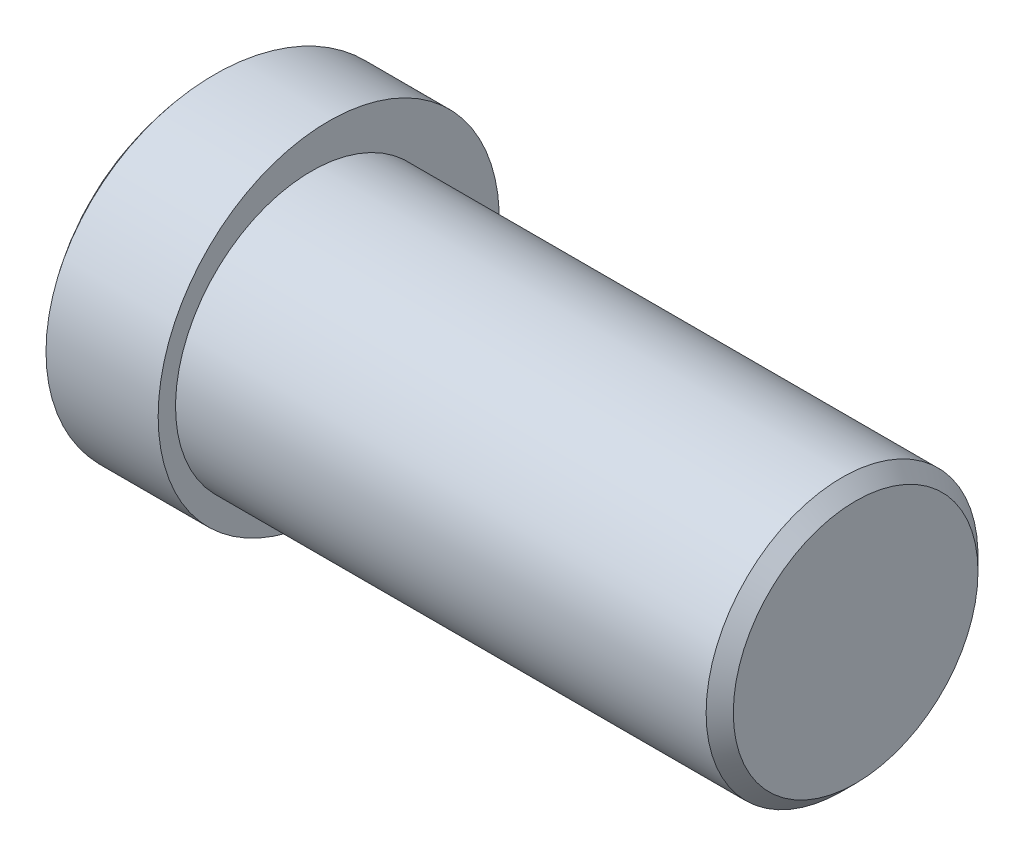
ISO-10303-21;
HEADER;
FILE_DESCRIPTION(('STEP AP214'),'2;1');
FILE_NAME('part.step','',(''),(''),'','','');
FILE_SCHEMA(('AUTOMOTIVE_DESIGN { 1 0 10303 214 1 1 1 1 }'));
ENDSEC;
DATA;
#1=APPLICATION_CONTEXT('core data for automotive mechanical design processes');
#2=APPLICATION_PROTOCOL_DEFINITION('international standard','automotive_design',2000,#1);
#3=PRODUCT_CONTEXT('',#1,'mechanical');
#4=PRODUCT('Part','Part','',(#3));
#5=PRODUCT_RELATED_PRODUCT_CATEGORY('part','',(#4));
#6=PRODUCT_DEFINITION_FORMATION('','',#4);
#7=PRODUCT_DEFINITION_CONTEXT('part definition',#1,'design');
#8=PRODUCT_DEFINITION('design','',#6,#7);
#9=PRODUCT_DEFINITION_SHAPE('','',#8);
#10=(LENGTH_UNIT() NAMED_UNIT(*) SI_UNIT(.MILLI.,.METRE.));
#11=(NAMED_UNIT(*) PLANE_ANGLE_UNIT() SI_UNIT($,.RADIAN.));
#12=(NAMED_UNIT(*) SI_UNIT($,.STERADIAN.) SOLID_ANGLE_UNIT());
#13=UNCERTAINTY_MEASURE_WITH_UNIT(LENGTH_MEASURE(1.E-05),#10,'distance_accuracy_value','');
#14=(GEOMETRIC_REPRESENTATION_CONTEXT(3) GLOBAL_UNCERTAINTY_ASSIGNED_CONTEXT((#13)) GLOBAL_UNIT_ASSIGNED_CONTEXT((#10,
#11,#12)) REPRESENTATION_CONTEXT('',''));
#15=CARTESIAN_POINT('',(0.,0.,0.));
#16=DIRECTION('',(0.,0.,1.));
#17=DIRECTION('',(1.,0.,0.));
#18=AXIS2_PLACEMENT_3D('',#15,#16,#17);
#19=CARTESIAN_POINT('',(3.0988,-2.423128504,-2.7813));
#20=DIRECTION('',(-1.,0.,0.));
#21=DIRECTION('',(0.,0.,1.));
#22=AXIS2_PLACEMENT_3D('',#19,#20,#21);
#23=PLANE('',#22);
#24=DIRECTION('',(0.,-1.,0.));
#25=VECTOR('',#24,1.);
#26=CARTESIAN_POINT('',(3.0988,-1.2043382187,-2.7813));
#27=LINE('',#26,#25);
#28=CARTESIAN_POINT('',(3.0988,3.07138375314289E-09,-2.7813));
#29=VERTEX_POINT('',#28);
#30=CARTESIAN_POINT('',(3.0988,-1.60578429281395,-2.7813));
#31=VERTEX_POINT('',#30);
#32=EDGE_CURVE('E98',#29,#31,#27,.T.);
#33=ORIENTED_EDGE('',*,*,#32,.T.);
#34=DIRECTION('',(0.,-0.499999999551654,0.866025404043292));
#35=VECTOR('',#34,1.);
#36=CARTESIAN_POINT('',(3.0988,-1.60578429402789,-2.7813));
#37=LINE('',#36,#35);
#38=CARTESIAN_POINT('',(3.0988,-2.40867644446618,-1.39065000657466));
#39=VERTEX_POINT('',#38);
#40=EDGE_CURVE('E20',#31,#39,#37,.T.);
#41=ORIENTED_EDGE('',*,*,#40,.T.);
#42=CARTESIAN_POINT('',(3.0988,0.,0.));
#43=DIRECTION('',(-1.,0.,0.));
#44=DIRECTION('',(0.,-1.,0.));
#45=AXIS2_PLACEMENT_3D('',#42,#43,#44);
#46=CIRCLE('',#45,2.7813);
#47=EDGE_CURVE('E109',#29,#39,#46,.T.);
#48=ORIENTED_EDGE('',*,*,#47,.F.);
#49=EDGE_LOOP('',(#33,#41,#48));
#50=FACE_BOUND('',#49,.T.);
#51=ADVANCED_FACE('F16',(#50),#23,.T.);
#52=CARTESIAN_POINT('',(3.0988,-3.2163859726,-1.4073378));
#53=DIRECTION('',(-1.,0.,0.));
#54=DIRECTION('',(0.,0.,1.));
#55=AXIS2_PLACEMENT_3D('',#52,#53,#54);
#56=PLANE('',#55);
#57=DIRECTION('',(0.,-0.500000007444029,0.866025399486626));
#58=VECTOR('',#57,1.);
#59=CARTESIAN_POINT('',(3.0988,-2.40867645200584,-1.39064999931024));
#60=LINE('',#59,#58);
#61=CARTESIAN_POINT('',(3.0988,-3.21156861602099,-1.1685023608432E-09));
#62=VERTEX_POINT('',#61);
#63=EDGE_CURVE('E93',#39,#62,#60,.T.);
#64=ORIENTED_EDGE('',*,*,#63,.T.);
#65=DIRECTION('',(0.,0.500000007444029,0.866025399486626));
#66=VECTOR('',#65,1.);
#67=CARTESIAN_POINT('',(3.0988,-3.21156861939416,0.));
#68=LINE('',#67,#66);
#69=CARTESIAN_POINT('',(3.0988,-2.40867644446618,1.39065000657466));
#70=VERTEX_POINT('',#69);
#71=EDGE_CURVE('E277',#62,#70,#68,.T.);
#72=ORIENTED_EDGE('',*,*,#71,.T.);
#73=CARTESIAN_POINT('',(3.0988,0.,0.));
#74=DIRECTION('',(-1.,0.,0.));
#75=DIRECTION('',(0.,-1.,0.));
#76=AXIS2_PLACEMENT_3D('',#73,#74,#75);
#77=CIRCLE('',#76,2.7813);
#78=EDGE_CURVE('E270',#39,#70,#77,.T.);
#79=ORIENTED_EDGE('',*,*,#78,.F.);
#80=EDGE_LOOP('',(#64,#72,#79));
#81=FACE_BOUND('',#80,.T.);
#82=ADVANCED_FACE('F226',(#81),#56,.T.);
#83=CARTESIAN_POINT('',(3.0988,-2.423128504,1.3823061));
#84=DIRECTION('',(-1.,0.,0.));
#85=DIRECTION('',(0.,0.,1.));
#86=AXIS2_PLACEMENT_3D('',#83,#84,#85);
#87=PLANE('',#86);
#88=DIRECTION('',(0.,0.499999999551654,0.866025404043292));
#89=VECTOR('',#88,1.);
#90=CARTESIAN_POINT('',(3.0988,-2.40867644468368,1.39065000040329));
#91=LINE('',#90,#89);
#92=CARTESIAN_POINT('',(3.0988,-1.60578429281395,2.7813));
#93=VERTEX_POINT('',#92);
#94=EDGE_CURVE('E274',#70,#93,#91,.T.);
#95=ORIENTED_EDGE('',*,*,#94,.T.);
#96=DIRECTION('',(0.,1.,0.));
#97=VECTOR('',#96,1.);
#98=CARTESIAN_POINT('',(3.0988,-1.2043382187,2.7813));
#99=LINE('',#98,#97);
#100=CARTESIAN_POINT('',(3.0988,3.39209483838232E-09,2.7813));
#101=VERTEX_POINT('',#100);
#102=EDGE_CURVE('E114',#93,#101,#99,.T.);
#103=ORIENTED_EDGE('',*,*,#102,.T.);
#104=CARTESIAN_POINT('',(3.0988,0.,0.));
#105=DIRECTION('',(-1.,0.,0.));
#106=DIRECTION('',(0.,-1.,0.));
#107=AXIS2_PLACEMENT_3D('',#104,#105,#106);
#108=CIRCLE('',#107,2.7813);
#109=EDGE_CURVE('E268',#70,#101,#108,.T.);
#110=ORIENTED_EDGE('',*,*,#109,.F.);
#111=EDGE_LOOP('',(#95,#103,#110));
#112=FACE_BOUND('',#111,.T.);
#113=ADVANCED_FACE('F222',(#112),#87,.T.);
#114=CARTESIAN_POINT('',(3.0988,-0.0144520666,1.3823061));
#115=DIRECTION('',(-1.,0.,0.));
#116=DIRECTION('',(0.,0.,1.));
#117=AXIS2_PLACEMENT_3D('',#114,#115,#116);
#118=PLANE('',#117);
#119=DIRECTION('',(0.,1.,0.));
#120=VECTOR('',#119,1.);
#121=CARTESIAN_POINT('',(3.0988,1.2043382187,2.7813));
#122=LINE('',#121,#120);
#123=CARTESIAN_POINT('',(3.0988,1.60578429281395,2.7813));
#124=VERTEX_POINT('',#123);
#125=EDGE_CURVE('E267',#101,#124,#122,.T.);
#126=ORIENTED_EDGE('',*,*,#125,.T.);
#127=DIRECTION('',(0.,0.499999999551653,-0.866025404043292));
#128=VECTOR('',#127,1.);
#129=CARTESIAN_POINT('',(3.0988,1.60578429402789,2.7813));
#130=LINE('',#129,#128);
#131=CARTESIAN_POINT('',(3.0988,2.40867644446618,1.39065000657465));
#132=VERTEX_POINT('',#131);
#133=EDGE_CURVE('E264',#124,#132,#130,.T.);
#134=ORIENTED_EDGE('',*,*,#133,.T.);
#135=CARTESIAN_POINT('',(3.0988,0.,0.));
#136=DIRECTION('',(-1.,0.,0.));
#137=DIRECTION('',(0.,-1.,0.));
#138=AXIS2_PLACEMENT_3D('',#135,#136,#137);
#139=CIRCLE('',#138,2.7813);
#140=EDGE_CURVE('E248',#101,#132,#139,.T.);
#141=ORIENTED_EDGE('',*,*,#140,.F.);
#142=EDGE_LOOP('',(#126,#134,#141));
#143=FACE_BOUND('',#142,.T.);
#144=ADVANCED_FACE('F218',(#143),#118,.T.);
#145=CARTESIAN_POINT('',(3.0988,2.4038590988,-1.4073378));
#146=DIRECTION('',(-1.,0.,0.));
#147=DIRECTION('',(0.,0.,1.));
#148=AXIS2_PLACEMENT_3D('',#145,#146,#147);
#149=PLANE('',#148);
#150=DIRECTION('',(0.,0.500000007444029,-0.866025399486626));
#151=VECTOR('',#150,1.);
#152=CARTESIAN_POINT('',(3.0988,2.40867645200584,1.39064999931024));
#153=LINE('',#152,#151);
#154=CARTESIAN_POINT('',(3.0988,3.21156861602099,1.16850238375509E-09));
#155=VERTEX_POINT('',#154);
#156=EDGE_CURVE('E262',#132,#155,#153,.T.);
#157=ORIENTED_EDGE('',*,*,#156,.T.);
#158=DIRECTION('',(0.,-0.500000007444029,-0.866025399486626));
#159=VECTOR('',#158,1.);
#160=CARTESIAN_POINT('',(3.0988,3.21156861939416,0.));
#161=LINE('',#160,#159);
#162=CARTESIAN_POINT('',(3.0988,2.40867644446618,-1.39065000657465));
#163=VERTEX_POINT('',#162);
#164=EDGE_CURVE('E253',#155,#163,#161,.T.);
#165=ORIENTED_EDGE('',*,*,#164,.T.);
#166=CARTESIAN_POINT('',(3.0988,0.,0.));
#167=DIRECTION('',(-1.,0.,0.));
#168=DIRECTION('',(0.,-1.,0.));
#169=AXIS2_PLACEMENT_3D('',#166,#167,#168);
#170=CIRCLE('',#169,2.7813);
#171=EDGE_CURVE('E241',#132,#163,#170,.T.);
#172=ORIENTED_EDGE('',*,*,#171,.F.);
#173=EDGE_LOOP('',(#157,#165,#172));
#174=FACE_BOUND('',#173,.T.);
#175=ADVANCED_FACE('F215',(#174),#149,.T.);
#176=CARTESIAN_POINT('',(4.7045842916,0.,0.));
#177=DIRECTION('',(-1.,0.,0.));
#178=DIRECTION('',(0.,-1.,0.));
#179=AXIS2_PLACEMENT_3D('',#176,#177,#178);
#180=CONICAL_SURFACE('',#179,0.,1.04719755445868);
#181=CARTESIAN_POINT('',(4.7045842916,0.,0.));
#182=VERTEX_POINT('',#181);
#183=VERTEX_LOOP('',#182);
#184=FACE_BOUND('',#183,.T.);
#185=ORIENTED_EDGE('',*,*,#171,.T.);
#186=CARTESIAN_POINT('',(3.0988,0.,0.));
#187=DIRECTION('',(-1.,0.,0.));
#188=DIRECTION('',(0.,-1.,0.));
#189=AXIS2_PLACEMENT_3D('',#186,#187,#188);
#190=CIRCLE('',#189,2.7813);
#191=EDGE_CURVE('E244',#29,#163,#190,.F.);
#192=ORIENTED_EDGE('',*,*,#191,.F.);
#193=ORIENTED_EDGE('',*,*,#47,.T.);
#194=ORIENTED_EDGE('',*,*,#78,.T.);
#195=ORIENTED_EDGE('',*,*,#109,.T.);
#196=ORIENTED_EDGE('',*,*,#140,.T.);
#197=EDGE_LOOP('',(#185,#192,#193,#194,#195,#196));
#198=FACE_BOUND('',#197,.T.);
#199=ADVANCED_FACE('F213',(#184,#198),#180,.F.);
#200=CARTESIAN_POINT('',(3.0988,-0.0144520666,-2.7813));
#201=DIRECTION('',(-1.,0.,0.));
#202=DIRECTION('',(0.,0.,1.));
#203=AXIS2_PLACEMENT_3D('',#200,#201,#202);
#204=PLANE('',#203);
#205=DIRECTION('',(0.,-0.499999999551653,-0.866025404043292));
#206=VECTOR('',#205,1.);
#207=CARTESIAN_POINT('',(3.0988,2.40867644468368,-1.39065000040329));
#208=LINE('',#207,#206);
#209=CARTESIAN_POINT('',(3.0988,1.60578429281395,-2.7813));
#210=VERTEX_POINT('',#209);
#211=EDGE_CURVE('E252',#163,#210,#208,.T.);
#212=ORIENTED_EDGE('',*,*,#211,.T.);
#213=DIRECTION('',(0.,1.,0.));
#214=VECTOR('',#213,1.);
#215=CARTESIAN_POINT('',(3.0988,0.,-2.7813));
#216=LINE('',#215,#214);
#217=EDGE_CURVE('E106',#29,#210,#216,.T.);
#218=ORIENTED_EDGE('',*,*,#217,.F.);
#219=ORIENTED_EDGE('',*,*,#191,.T.);
#220=EDGE_LOOP('',(#212,#218,#219));
#221=FACE_BOUND('',#220,.T.);
#222=ADVANCED_FACE('F210',(#221),#204,.T.);
#223=CARTESIAN_POINT('',(0.,-1.6057842916,-2.7813));
#224=DIRECTION('',(0.,0.866025401990822,0.500000003106635));
#225=DIRECTION('',(0.,-0.500000003106635,0.866025401990822));
#226=AXIS2_PLACEMENT_3D('',#223,#224,#225);
#227=PLANE('',#226);
#228=DIRECTION('',(-1.,0.,0.));
#229=VECTOR('',#228,1.);
#230=CARTESIAN_POINT('',(1.5494,-3.2115686086,0.));
#231=LINE('',#230,#229);
#232=CARTESIAN_POINT('',(0.,-3.2115686053299,-5.14906847915595E-10));
#233=VERTEX_POINT('',#232);
#234=EDGE_CURVE('E118',#62,#233,#231,.T.);
#235=ORIENTED_EDGE('',*,*,#234,.F.);
#236=ORIENTED_EDGE('',*,*,#63,.F.);
#237=ORIENTED_EDGE('',*,*,#40,.F.);
#238=DIRECTION('',(1.,0.,0.));
#239=VECTOR('',#238,1.);
#240=CARTESIAN_POINT('',(1.5494,-1.6057842916,-2.7813));
#241=LINE('',#240,#239);
#242=CARTESIAN_POINT('',(0.,-1.60578429676087,-2.78130000008352));
#243=VERTEX_POINT('',#242);
#244=EDGE_CURVE('E90',#243,#31,#241,.T.);
#245=ORIENTED_EDGE('',*,*,#244,.F.);
#246=DIRECTION('',(0.,0.499999999570386,-0.866025404032477));
#247=VECTOR('',#246,1.);
#248=CARTESIAN_POINT('',(0.,-3.2115686038435,0.));
#249=LINE('',#248,#247);
#250=EDGE_CURVE('E117',#233,#243,#249,.T.);
#251=ORIENTED_EDGE('',*,*,#250,.F.);
#252=EDGE_LOOP('',(#235,#236,#237,#245,#251));
#253=FACE_BOUND('',#252,.T.);
#254=ADVANCED_FACE('F89',(#253),#227,.T.);
#255=CARTESIAN_POINT('',(0.,1.6057842916,-2.7813));
#256=DIRECTION('',(0.,0.,1.));
#257=DIRECTION('',(0.,-1.,0.));
#258=AXIS2_PLACEMENT_3D('',#255,#256,#257);
#259=PLANE('',#258);
#260=ORIENTED_EDGE('',*,*,#244,.T.);
#261=ORIENTED_EDGE('',*,*,#32,.F.);
#262=ORIENTED_EDGE('',*,*,#217,.T.);
#263=DIRECTION('',(1.,0.,0.));
#264=VECTOR('',#263,1.);
#265=CARTESIAN_POINT('',(1.5494,1.6057842916,-2.7813));
#266=LINE('',#265,#264);
#267=CARTESIAN_POINT('',(0.,1.60578429676087,-2.78130000008352));
#268=VERTEX_POINT('',#267);
#269=EDGE_CURVE('E105',#268,#210,#266,.T.);
#270=ORIENTED_EDGE('',*,*,#269,.F.);
#271=DIRECTION('',(0.,1.,0.));
#272=VECTOR('',#271,1.);
#273=CARTESIAN_POINT('',(0.,0.,-2.78130000011135));
#274=LINE('',#273,#272);
#275=EDGE_CURVE('E103',#243,#268,#274,.T.);
#276=ORIENTED_EDGE('',*,*,#275,.F.);
#277=EDGE_LOOP('',(#260,#261,#262,#270,#276));
#278=FACE_BOUND('',#277,.T.);
#279=ADVANCED_FACE('F100',(#278),#259,.T.);
#280=CARTESIAN_POINT('',(0.,3.2115686086,0.));
#281=DIRECTION('',(0.,-0.866025401990822,0.500000003106635));
#282=DIRECTION('',(0.,-0.500000003106635,-0.866025401990822));
#283=AXIS2_PLACEMENT_3D('',#280,#281,#282);
#284=PLANE('',#283);
#285=ORIENTED_EDGE('',*,*,#269,.T.);
#286=ORIENTED_EDGE('',*,*,#211,.F.);
#287=ORIENTED_EDGE('',*,*,#164,.F.);
#288=DIRECTION('',(1.,0.,0.));
#289=VECTOR('',#288,1.);
#290=CARTESIAN_POINT('',(1.5494,3.2115686086,0.));
#291=LINE('',#290,#289);
#292=CARTESIAN_POINT('',(0.,3.2115686053299,5.14906351638284E-10));
#293=VERTEX_POINT('',#292);
#294=EDGE_CURVE('E285',#293,#155,#291,.T.);
#295=ORIENTED_EDGE('',*,*,#294,.F.);
#296=DIRECTION('',(0.,0.499999999570385,0.866025404032477));
#297=VECTOR('',#296,1.);
#298=CARTESIAN_POINT('',(0.,1.60578430192175,-2.78130000011135));
#299=LINE('',#298,#297);
#300=EDGE_CURVE('E128',#268,#293,#299,.T.);
#301=ORIENTED_EDGE('',*,*,#300,.F.);
#302=EDGE_LOOP('',(#285,#286,#287,#295,#301));
#303=FACE_BOUND('',#302,.T.);
#304=ADVANCED_FACE('F201',(#303),#284,.T.);
#305=CARTESIAN_POINT('',(0.,1.6057842916,2.7813));
#306=DIRECTION('',(0.,-0.866025401990822,-0.500000003106635));
#307=DIRECTION('',(0.,0.500000003106635,-0.866025401990822));
#308=AXIS2_PLACEMENT_3D('',#305,#306,#307);
#309=PLANE('',#308);
#310=ORIENTED_EDGE('',*,*,#294,.T.);
#311=ORIENTED_EDGE('',*,*,#156,.F.);
#312=ORIENTED_EDGE('',*,*,#133,.F.);
#313=DIRECTION('',(1.,0.,0.));
#314=VECTOR('',#313,1.);
#315=CARTESIAN_POINT('',(1.5494,1.6057842916,2.7813));
#316=LINE('',#315,#314);
#317=CARTESIAN_POINT('',(0.,1.60578429676087,2.78130000008352));
#318=VERTEX_POINT('',#317);
#319=EDGE_CURVE('E120',#318,#124,#316,.T.);
#320=ORIENTED_EDGE('',*,*,#319,.F.);
#321=DIRECTION('',(0.,-0.499999999570385,0.866025404032477));
#322=VECTOR('',#321,1.);
#323=CARTESIAN_POINT('',(0.,3.2115686038435,0.));
#324=LINE('',#323,#322);
#325=EDGE_CURVE('E126',#293,#318,#324,.T.);
#326=ORIENTED_EDGE('',*,*,#325,.F.);
#327=EDGE_LOOP('',(#310,#311,#312,#320,#326));
#328=FACE_BOUND('',#327,.T.);
#329=ADVANCED_FACE('F198',(#328),#309,.T.);
#330=CARTESIAN_POINT('',(0.,-1.6057842916,2.7813));
#331=DIRECTION('',(0.,0.,-1.));
#332=DIRECTION('',(0.,1.,0.));
#333=AXIS2_PLACEMENT_3D('',#330,#331,#332);
#334=PLANE('',#333);
#335=ORIENTED_EDGE('',*,*,#319,.T.);
#336=ORIENTED_EDGE('',*,*,#125,.F.);
#337=ORIENTED_EDGE('',*,*,#102,.F.);
#338=DIRECTION('',(1.,0.,0.));
#339=VECTOR('',#338,1.);
#340=CARTESIAN_POINT('',(1.5494,-1.6057842916,2.7813));
#341=LINE('',#340,#339);
#342=CARTESIAN_POINT('',(0.,-1.60578429676087,2.78130000008352));
#343=VERTEX_POINT('',#342);
#344=EDGE_CURVE('E35',#343,#93,#341,.T.);
#345=ORIENTED_EDGE('',*,*,#344,.F.);
#346=DIRECTION('',(0.,-1.,0.));
#347=VECTOR('',#346,1.);
#348=CARTESIAN_POINT('',(0.,0.,2.78130000011135));
#349=LINE('',#348,#347);
#350=EDGE_CURVE('E122',#318,#343,#349,.T.);
#351=ORIENTED_EDGE('',*,*,#350,.F.);
#352=EDGE_LOOP('',(#335,#336,#337,#345,#351));
#353=FACE_BOUND('',#352,.T.);
#354=ADVANCED_FACE('F194',(#353),#334,.T.);
#355=CARTESIAN_POINT('',(0.,-3.2115686086,0.));
#356=DIRECTION('',(0.,0.866025401990822,-0.500000003106635));
#357=DIRECTION('',(0.,0.500000003106635,0.866025401990822));
#358=AXIS2_PLACEMENT_3D('',#355,#356,#357);
#359=PLANE('',#358);
#360=ORIENTED_EDGE('',*,*,#344,.T.);
#361=ORIENTED_EDGE('',*,*,#94,.F.);
#362=ORIENTED_EDGE('',*,*,#71,.F.);
#363=ORIENTED_EDGE('',*,*,#234,.T.);
#364=DIRECTION('',(0.,-0.499999999570386,-0.866025404032477));
#365=VECTOR('',#364,1.);
#366=CARTESIAN_POINT('',(0.,-1.60578430192175,2.78130000011135));
#367=LINE('',#366,#365);
#368=EDGE_CURVE('E125',#343,#233,#367,.T.);
#369=ORIENTED_EDGE('',*,*,#368,.F.);
#370=EDGE_LOOP('',(#360,#361,#362,#363,#369));
#371=FACE_BOUND('',#370,.T.);
#372=ADVANCED_FACE('F190',(#371),#359,.T.);
#373=CARTESIAN_POINT('',(0.,-4.2155872,-4.2155872));
#374=DIRECTION('',(-1.,0.,0.));
#375=DIRECTION('',(0.,0.,1.));
#376=AXIS2_PLACEMENT_3D('',#373,#374,#375);
#377=PLANE('',#376);
#378=ORIENTED_EDGE('',*,*,#350,.T.);
#379=ORIENTED_EDGE('',*,*,#368,.T.);
#380=ORIENTED_EDGE('',*,*,#250,.T.);
#381=ORIENTED_EDGE('',*,*,#275,.T.);
#382=ORIENTED_EDGE('',*,*,#300,.T.);
#383=ORIENTED_EDGE('',*,*,#325,.T.);
#384=EDGE_LOOP('',(#378,#379,#380,#381,#382,#383));
#385=FACE_BOUND('',#384,.T.);
#386=CARTESIAN_POINT('',(0.,-4.33746052343799E-08,-4.16559998262733));
#387=CARTESIAN_POINT('',(0.,0.116956940799333,-4.16559928310084));
#388=CARTESIAN_POINT('',(0.,0.233935418997958,-4.16066990362673));
#389=CARTESIAN_POINT('',(0.,0.467083982941456,-4.1409844299431));
#390=CARTESIAN_POINT('',(0.,0.583253819789103,-4.126225434579));
#391=CARTESIAN_POINT('',(0.,0.814132760105719,-4.08694713377141));
#392=CARTESIAN_POINT('',(0.,0.928839245096188,-4.0624123349472));
#393=CARTESIAN_POINT('',(0.,1.15584138311768,-4.00375153705254));
#394=CARTESIAN_POINT('',(0.,1.26813499981041,-3.96961775466113));
#395=CARTESIAN_POINT('',(0.,1.59971282839235,-3.85328992141792));
#396=CARTESIAN_POINT('',(0.,1.81425203642017,-3.757073834327));
#397=CARTESIAN_POINT('',(0.,2.22410832340742,-3.52993779789885));
#398=CARTESIAN_POINT('',(0.,2.41942467126494,-3.39901652932035));
#399=CARTESIAN_POINT('',(0.,2.69373793411215,-3.17958779749195));
#400=CARTESIAN_POINT('',(0.,2.78211715246121,-3.10254581600432));
#401=CARTESIAN_POINT('',(0.,2.95201113478659,-2.94134910246686));
#402=CARTESIAN_POINT('',(0.,3.0335324349747,-2.85720129979704));
#403=CARTESIAN_POINT('',(0.,3.18922908027101,-2.68230518494734));
#404=CARTESIAN_POINT('',(0.,3.26340108099478,-2.59155390005918));
#405=CARTESIAN_POINT('',(0.,3.4038549768125,-2.40410317676134));
#406=CARTESIAN_POINT('',(0.,3.47013504048986,-2.30740236556026));
#407=CARTESIAN_POINT('',(0.,3.59429044264592,-2.10879346023317));
#408=CARTESIAN_POINT('',(0.,3.65216861214503,-2.00688713582584));
#409=CARTESIAN_POINT('',(0.,3.75915578132453,-1.79852528896877));
#410=CARTESIAN_POINT('',(0.,3.80826154181887,-1.69206810403475));
#411=CARTESIAN_POINT('',(0.,3.89731176541049,-1.47542822629428));
#412=CARTESIAN_POINT('',(0.,3.93725972009721,-1.36524697180749));
#413=CARTESIAN_POINT('',(0.,4.00774569112913,-1.14189921970833));
#414=CARTESIAN_POINT('',(0.,4.03828018061328,-1.02873162042515));
#415=CARTESIAN_POINT('',(0.,4.11536880626822,-0.686051433431925));
#416=CARTESIAN_POINT('',(0.,4.14750441870545,-0.453126465782665));
#417=CARTESIAN_POINT('',(0.,4.1721573723497,0.0148107312473979));
#418=CARTESIAN_POINT('',(0.,4.16467471355672,0.249822960628201));
#419=CARTESIAN_POINT('',(0.,4.12402064512681,0.598706341525134));
#420=CARTESIAN_POINT('',(0.,4.10554650218217,0.71445592732278));
#421=CARTESIAN_POINT('',(0.,4.05891944397755,0.943973699838291));
#422=CARTESIAN_POINT('',(0.,4.03077015181451,1.05774261153628));
#423=CARTESIAN_POINT('',(0.,3.96497676785762,1.28254031960641));
#424=CARTESIAN_POINT('',(0.,3.92732905266919,1.39356805250702));
#425=CARTESIAN_POINT('',(0.,3.84282818990009,1.61201831632628));
#426=CARTESIAN_POINT('',(0.,3.79597843826246,1.71944216016197));
#427=CARTESIAN_POINT('',(0.,3.6933795746062,1.92999746004243));
#428=CARTESIAN_POINT('',(0.,3.63762746128357,2.03312745364104));
#429=CARTESIAN_POINT('',(0.,3.51764786282171,2.23429893878396));
#430=CARTESIAN_POINT('',(0.,3.45342234320931,2.33234160308027));
#431=CARTESIAN_POINT('',(0.,3.31696517733255,2.52262964315274));
#432=CARTESIAN_POINT('',(0.,3.24473716930144,2.61487762376257));
#433=CARTESIAN_POINT('',(0.,3.09272176976397,2.79303391458037));
#434=CARTESIAN_POINT('',(0.,3.01292715011134,2.8789360205742));
#435=CARTESIAN_POINT('',(0.,2.76318937082376,3.12597402587352));
#436=CARTESIAN_POINT('',(0.,2.58271108913844,3.27669377946219));
#437=CARTESIAN_POINT('',(0.,2.19899050003856,3.54563887503475));
#438=CARTESIAN_POINT('',(0.,1.99574905830029,3.66386545213443));
#439=CARTESIAN_POINT('',(0.,1.67823019297332,3.81439050420153));
#440=CARTESIAN_POINT('',(0.,1.57014489865294,3.8601347999657));
#441=CARTESIAN_POINT('',(0.,1.35056332395464,3.94232355770728));
#442=CARTESIAN_POINT('',(0.,1.23906988649006,3.97877554594589));
#443=CARTESIAN_POINT('',(0.,1.013596316693,4.04209646908053));
#444=CARTESIAN_POINT('',(0.,0.899620416340225,4.0689805364423));
#445=CARTESIAN_POINT('',(0.,0.669831032057145,4.11305558179943));
#446=CARTESIAN_POINT('',(0.,0.55401810049056,4.13024941873439));
#447=CARTESIAN_POINT('',(0.,0.365021383242316,4.15022031816648));
#448=CARTESIAN_POINT('',(0.,0.292140194622892,4.15598586795723));
#449=CARTESIAN_POINT('',(0.,0.146175454423056,4.16367591959591));
#450=CARTESIAN_POINT('',(0.,0.073091902842645,4.16560042144386));
#451=CARTESIAN_POINT('',(0.,-0.11695702758603,4.16559928046161));
#452=CARTESIAN_POINT('',(0.,-0.233935505695445,4.16066989834507));
#453=CARTESIAN_POINT('',(0.,-0.467084069233327,4.14098441939132));
#454=CARTESIAN_POINT('',(0.,-0.583253905764597,4.12622542140063));
#455=CARTESIAN_POINT('',(0.,-0.814132845186528,4.08694711537686));
#456=CARTESIAN_POINT('',(0.,-0.928839329598885,4.06241231396638));
#457=CARTESIAN_POINT('',(0.,-1.15584146625278,4.0037515109566));
#458=CARTESIAN_POINT('',(0.,-1.26813508215576,3.96961772603609));
#459=CARTESIAN_POINT('',(0.,-1.59971290809463,3.85328988531639));
#460=CARTESIAN_POINT('',(0.,-1.81425211395194,3.75707379338339));
#461=CARTESIAN_POINT('',(0.,-2.22410839581312,3.52993774770559));
#462=CARTESIAN_POINT('',(0.,-2.41942474071522,3.39901647471984));
#463=CARTESIAN_POINT('',(0.,-2.69373799861066,3.1795877367008));
#464=CARTESIAN_POINT('',(0.,-2.78211721522196,3.10254575321787));
#465=CARTESIAN_POINT('',(0.,-2.9520111939113,2.94134903584444));
#466=CARTESIAN_POINT('',(0.,-3.03353249220126,2.85720123133381));
#467=CARTESIAN_POINT('',(0.,-3.18922913355038,2.68230511297009));
#468=CARTESIAN_POINT('',(0.,-3.26340113222521,2.59155382640895));
#469=CARTESIAN_POINT('',(0.,-3.40385502381096,2.40410309994337));
#470=CARTESIAN_POINT('',(0.,-3.47013508530526,2.30740228724757));
#471=CARTESIAN_POINT('',(0.,-3.59429048297843,2.10879337911995));
#472=CARTESIAN_POINT('',(0.,-3.65216865017768,2.00688705340667));
#473=CARTESIAN_POINT('',(0.,-3.75915581465483,1.79852520413565));
#474=CARTESIAN_POINT('',(0.,-3.80826157274664,1.69206801809367));
#475=CARTESIAN_POINT('',(0.,-3.89731179144935,1.47542813834361));
#476=CARTESIAN_POINT('',(0.,-3.93725974364969,1.36524688295508));
#477=CARTESIAN_POINT('',(0.,-4.00774570964145,1.14189912926479));
#478=CARTESIAN_POINT('',(0.,-4.03828019657178,1.0287315292923));
#479=CARTESIAN_POINT('',(0.,-4.11536881449343,0.686051340559033));
#480=CARTESIAN_POINT('',(0.,-4.14750442167418,0.453126372184434));
#481=CARTESIAN_POINT('',(0.,-4.17215736475831,-0.0148108254019807));
#482=CARTESIAN_POINT('',(0.,-4.16467470066174,-0.249823054613794));
#483=CARTESIAN_POINT('',(0.,-4.12402062435851,-0.598706434592909));
#484=CARTESIAN_POINT('',(0.,-4.10554647880176,-0.714456019973405));
#485=CARTESIAN_POINT('',(0.,-4.05891941541768,-0.943973791436201));
#486=CARTESIAN_POINT('',(0.,-4.03077012068727,-1.05774270249871));
#487=CARTESIAN_POINT('',(0.,-3.96497673165738,-1.28254040908408));
#488=CARTESIAN_POINT('',(0.,-3.92732901396331,-1.39356814113532));
#489=CARTESIAN_POINT('',(0.,-3.84282814626424,-1.6120184030481));
#490=CARTESIAN_POINT('',(0.,-3.79597839220226,-1.71944224582674));
#491=CARTESIAN_POINT('',(0.,-3.69337952379366,-1.92999754339321));
#492=CARTESIAN_POINT('',(0.,-3.63762740814299,-2.03312753573478));
#493=CARTESIAN_POINT('',(0.,-3.51764780513973,-2.23429901817217));
#494=CARTESIAN_POINT('',(0.,-3.45342228331393,-2.33234168102005));
#495=CARTESIAN_POINT('',(0.,-3.31696511314259,-2.52262971801272));
#496=CARTESIAN_POINT('',(0.,-3.24473710303042,-2.61487769699138));
#497=CARTESIAN_POINT('',(0.,-3.09272169947396,-2.79303398437651));
#498=CARTESIAN_POINT('',(0.,-3.01292707788353,-2.87893608856868));
#499=CARTESIAN_POINT('',(0.,-2.76318929302111,-3.12597408823196));
#500=CARTESIAN_POINT('',(0.,-2.58271100793362,-3.27669383774831));
#501=CARTESIAN_POINT('',(0.,-2.19899041276412,-3.54563892466106));
#502=CARTESIAN_POINT('',(0.,-1.99574896835857,-3.66386549717353));
#503=CARTESIAN_POINT('',(0.,-1.67823009961755,-3.81439054208327));
#504=CARTESIAN_POINT('',(0.,-1.57014480424605,-3.86013483541532));
#505=CARTESIAN_POINT('',(0.,-1.35056322765024,-3.9423235882138));
#506=CARTESIAN_POINT('',(0.,-1.239069789339,-3.9787755739412));
#507=CARTESIAN_POINT('',(0.,-1.01359621810409,-4.04209649198255));
#508=CARTESIAN_POINT('',(0.,-0.899620317160704,-4.06898055676551));
#509=CARTESIAN_POINT('',(0.,-0.669830931920485,-4.11305559692431));
#510=CARTESIAN_POINT('',(0.,-0.554017999987527,-4.13024943124084));
#511=CARTESIAN_POINT('',(0.,-0.365021313488625,-4.15022032311124));
#512=CARTESIAN_POINT('',(0.,-0.292140156074076,-4.15598586960581));
#513=CARTESIAN_POINT('',(0.,-0.146175478457596,-4.16367591794733));
#514=CARTESIAN_POINT('',(0.,-0.0730919582556646,-4.1656004197943));
#515=CARTESIAN_POINT('',(0.,-4.33746052343799E-08,-4.16559998262733));
#516=B_SPLINE_CURVE_WITH_KNOTS('',3,(#386,#387,#388,#389,#390,#391,#392,#393,#394,#395,#396,
#397,#398,#399,#400,#401,#402,#403,#404,#405,#406,#407,#408,#409,#410,#411,#412,#413,#414,#415,
#416,#417,#418,#419,#420,#421,#422,#423,#424,#425,#426,#427,#428,#429,#430,#431,#432,#433,#434,
#435,#436,#437,#438,#439,#440,#441,#442,#443,#444,#445,#446,#447,#448,#449,#450,#451,#452,#453,
#454,#455,#456,#457,#458,#459,#460,#461,#462,#463,#464,#465,#466,#467,#468,#469,#470,#471,#472,
#473,#474,#475,#476,#477,#478,#479,#480,#481,#482,#483,#484,#485,#486,#487,#488,#489,#490,#491,
#492,#493,#494,#495,#496,#497,#498,#499,#500,#501,#502,#503,#504,#505,#506,#507,#508,#509,#510,
#511,#512,#513,#514,#515),.UNSPECIFIED.,.T.,.F.,(4,2,2,2,2,2,2,2,2,2,2,2,2,2,2,2,2,2,2,2,2,2,2,
2,2,2,2,2,2,2,2,2,2,2,2,2,2,2,2,2,2,2,2,2,2,2,2,2,2,2,2,2,2,2,2,2,2,2,2,2,2,2,2,2,4),(0.,
0.350803664538221,0.701710912670132,1.05317652961303,1.40492795772027,2.10675405637381,
2.80860683723175,3.15999307231415,3.5110405181415,3.86224698552181,4.21353479629329,
4.56470396442329,4.91600253391102,5.26716694047545,5.61846275530509,6.32030219485264,
7.02214163440016,7.37343744915696,7.72460185564855,8.07590042506169,8.42706959311718,
8.77835740378112,9.12956387105405,9.48061131678205,9.83199755176435,10.5338503324668,
11.2356764309712,11.587427858989,11.9388934758314,12.2898007239807,12.6406043885758,
12.8598381757701,13.0790719629645,13.4298756275884,13.7807828757664,14.1322484926379,
14.4839999206848,15.1858260193414,15.8876788001962,16.2390650352822,16.5901124811137,
16.9413189484902,17.2926067592578,17.6437759273871,17.9950744968741,18.3462389034392,
18.6975347182696,19.3993741578175,20.1012135973647,20.4525094121207,20.8036738186116,
21.1549723880255,21.5061415560817,21.8574293667495,22.2086358340263,22.5596832797501,
22.9110695147288,23.6129222954343,24.3147483939357,24.6664998220138,25.0179654389277,
25.3688726870308,25.7196763515403,25.9389100447608,26.1581437379814),.UNSPECIFIED.);
#517=CARTESIAN_POINT('',(0.,-4.33746052343799E-08,-4.16559998262733));
#518=VERTEX_POINT('',#517);
#519=EDGE_CURVE('E145',#518,#518,#516,.T.);
#520=ORIENTED_EDGE('',*,*,#519,.F.);
#521=EDGE_LOOP('',(#520));
#522=FACE_BOUND('',#521,.T.);
#523=ADVANCED_FACE('F186',(#385,#522),#377,.T.);
#524=CARTESIAN_POINT('',(8.23322857142857,3.62856931168665E-09,0.));
#525=DIRECTION('',(0.,1.,0.));
#526=DIRECTION('',(0.656063857004314,0.,0.754705383267288));
#527=AXIS2_PLACEMENT_3D('',#524,#525,#526);
#528=SPHERICAL_SURFACE('',#527,9.227040474);
#529=CARTESIAN_POINT('',(0.929653386773737,-3.4699684690108E-08,5.6388));
#530=CARTESIAN_POINT('',(0.929653461234764,0.17564649087597,5.63879902186465));
#531=CARTESIAN_POINT('',(0.930295170125144,0.351324900189222,5.63141739750465));
#532=CARTESIAN_POINT('',(0.932858916741199,0.701468722489753,5.60193780643352));
#533=CARTESIAN_POINT('',(0.934781335826574,0.875933758528063,5.5798354563022));
#534=CARTESIAN_POINT('',(0.939899929819515,1.22265620736924,5.52102490107322));
#535=CARTESIAN_POINT('',(0.943098129022051,1.39490966052207,5.48429348401504));
#536=CARTESIAN_POINT('',(0.950753071282689,1.73582997620397,5.39645690882774));
#537=CARTESIAN_POINT('',(0.955210824693181,1.90449384206988,5.34534021166754));
#538=CARTESIAN_POINT('',(0.965349055784113,2.23659308296145,5.22922246244253));
#539=CARTESIAN_POINT('',(0.971027316712107,2.40003732804326,5.16424658379806));
#540=CARTESIAN_POINT('',(0.983581525914815,2.72093043881227,5.02079400527223));
#541=CARTESIAN_POINT('',(0.99045801454367,2.87837656037376,4.94231121449609));
#542=CARTESIAN_POINT('',(1.00536766085061,3.18609166565513,4.77242778538811));
#543=CARTESIAN_POINT('',(1.01340088133982,3.33636025904116,4.68102644557753));
#544=CARTESIAN_POINT('',(1.0305732812542,3.62858749450875,4.48601185828784));
#545=CARTESIAN_POINT('',(1.03971196384853,3.77054982744519,4.38240409731534));
#546=CARTESIAN_POINT('',(1.05906645075667,4.04554851739677,4.16344393410369));
#547=CARTESIAN_POINT('',(1.06928460744938,4.17856430185847,4.04806590179913));
#548=CARTESIAN_POINT('',(1.0907106111653,4.43426600372001,3.80670367971603));
#549=CARTESIAN_POINT('',(1.10191749244249,4.55696177734365,3.68072984497538));
#550=CARTESIAN_POINT('',(1.12526837175717,4.79136648202503,3.41891916329961));
#551=CARTESIAN_POINT('',(1.13741280321341,4.90307027668106,3.28307775643334));
#552=CARTESIAN_POINT('',(1.16256439718466,5.11467511348159,3.00251904723939));
#553=CARTESIAN_POINT('',(1.17557176183772,5.21457337488488,2.85779966589016));
#554=CARTESIAN_POINT('',(1.20241149462755,5.4021505329515,2.56005795446411));
#555=CARTESIAN_POINT('',(1.21624640750492,5.48978864639109,2.40701015975644));
#556=CARTESIAN_POINT('',(1.24462258889149,5.65188176180373,2.09407693709827));
#557=CARTESIAN_POINT('',(1.25916411592644,5.72633189176121,1.93418900917712));
#558=CARTESIAN_POINT('',(1.2888524197239,5.86147117590238,1.60882312763845));
#559=CARTESIAN_POINT('',(1.30399897435457,5.92216532686281,1.44334722899473));
#560=CARTESIAN_POINT('',(1.33481194455481,6.02943097946882,1.10785827384659));
#561=CARTESIAN_POINT('',(1.35047855303722,6.07599717393945,0.937843538353756));
#562=CARTESIAN_POINT('',(1.38227876545454,6.15479107679857,0.593956753969178));
#563=CARTESIAN_POINT('',(1.39841376731996,6.18696985129185,0.420073621168688));
#564=CARTESIAN_POINT('',(1.43100059755403,6.23654967965567,0.0701616559193552));
#565=CARTESIAN_POINT('',(1.44745256629524,6.25394402471657,-0.105868113909592));
#566=CARTESIAN_POINT('',(1.48055547645214,6.27381333326084,-0.458751605923635));
#567=CARTESIAN_POINT('',(1.49720642078699,6.27628807758961,-0.635605340173789));
#568=CARTESIAN_POINT('',(1.5305848238305,6.26630577479781,-0.988802927582281));
#569=CARTESIAN_POINT('',(1.54731224469088,6.25385545382365,-1.16514697454664));
#570=CARTESIAN_POINT('',(1.58078133643408,6.21406580513925,-1.51666232373165));
#571=CARTESIAN_POINT('',(1.59752291104781,6.18668396023333,-1.69182882410774));
#572=CARTESIAN_POINT('',(1.63084486632134,6.11720842735501,-2.03916647838969));
#573=CARTESIAN_POINT('',(1.64742530476835,6.07512022982894,-2.2113387250178));
#574=CARTESIAN_POINT('',(1.68031497820917,5.97650472363745,-2.55159725287188));
#575=CARTESIAN_POINT('',(1.69662410528203,5.91997180889678,-2.71968191988413));
#576=CARTESIAN_POINT('',(1.72883468763078,5.79289301021358,-3.05043624451458));
#577=CARTESIAN_POINT('',(1.74473629183322,5.72235233020346,-3.21310788696454));
#578=CARTESIAN_POINT('',(1.77601762592525,5.5677208436486,-3.53197325311019));
#579=CARTESIAN_POINT('',(1.79139724607018,5.48362720876296,-3.68816561608355));
#580=CARTESIAN_POINT('',(1.8215047326731,5.30250975081154,-3.99288072995771));
#581=CARTESIAN_POINT('',(1.83623275202062,5.2054889825903,-4.14140528138911));
#582=CARTESIAN_POINT('',(1.86491355838729,4.99923050949782,-4.42968818840575));
#583=CARTESIAN_POINT('',(1.87886670544988,4.88999855084628,-4.56945061925768));
#584=CARTESIAN_POINT('',(1.90590147591763,4.65993505188728,-4.83940888150631));
#585=CARTESIAN_POINT('',(1.91898222896075,4.53909221256848,-4.96959517200714));
#586=CARTESIAN_POINT('',(1.94409794082875,4.28721897810132,-5.21884061877169));
#587=CARTESIAN_POINT('',(1.95613658569356,4.15622788077019,-5.33793911688065));
#588=CARTESIAN_POINT('',(1.97912185902591,3.88453188407261,-5.56473694796513));
#589=CARTESIAN_POINT('',(1.99006799011781,3.74382260930507,-5.67243109036497));
#590=CARTESIAN_POINT('',(2.01076321827713,3.45375186975271,-5.87556420923399));
#591=CARTESIAN_POINT('',(2.02051240290852,3.30439103906026,-5.97100408220159));
#592=CARTESIAN_POINT('',(2.03872139758883,2.99814241449067,-6.1488962783479));
#593=CARTESIAN_POINT('',(2.04718179973323,2.84125812088334,-6.2313545661436));
#594=CARTESIAN_POINT('',(2.06271565896317,2.52152166674019,-6.38249218049219));
#595=CARTESIAN_POINT('',(2.06979336063895,2.35868965145016,-6.45121369152673));
#596=CARTESIAN_POINT('',(2.08252302245206,2.02789281311259,-6.57464272408931));
#597=CARTESIAN_POINT('',(2.08817613264711,1.85993225390395,-6.62936155039356));
#598=CARTESIAN_POINT('',(2.09800236662501,1.52023686083995,-6.72437638889807));
#599=CARTESIAN_POINT('',(2.10217787905601,1.34850859955793,-6.76469568001527));
#600=CARTESIAN_POINT('',(2.10902081981245,1.00227322106185,-6.8307288806278));
#601=CARTESIAN_POINT('',(2.11168870643243,0.827766964917273,-6.85644722859157));
#602=CARTESIAN_POINT('',(2.11476641603066,0.544150308744894,-6.88610754429023));
#603=CARTESIAN_POINT('',(2.11564944129316,0.435502012364507,-6.89461449389268));
#604=CARTESIAN_POINT('',(2.11682731664718,0.217906607208788,-6.90596102903792));
#605=CARTESIAN_POINT('',(2.11712216662209,0.108959498374216,-6.90880061345708));
#606=CARTESIAN_POINT('',(2.11712197149147,-0.175468365523435,-6.90879901208931));
#607=CARTESIAN_POINT('',(2.11635699773691,-0.350968919644093,-6.9014322974722));
#608=CARTESIAN_POINT('',(2.11330369145076,-0.700757176312926,-6.87201274727602));
#609=CARTESIAN_POINT('',(2.11101490052277,-0.875044497948776,-6.84995549247138));
#610=CARTESIAN_POINT('',(2.10493066150661,-1.22141258154183,-6.79126649813535));
#611=CARTESIAN_POINT('',(2.10113280946291,-1.39348936837042,-6.75461150398812));
#612=CARTESIAN_POINT('',(2.09206302968125,-1.73405684006889,-6.66696125413588));
#613=CARTESIAN_POINT('',(2.08678992571179,-1.90254454750214,-6.61595455550268));
#614=CARTESIAN_POINT('',(2.07483189158314,-2.23428755862005,-6.50009482784461));
#615=CARTESIAN_POINT('',(2.0681495934287,-2.39755197229686,-6.43526760948798));
#616=CARTESIAN_POINT('',(2.05342619312639,-2.71809412651019,-6.29215054462493));
#617=CARTESIAN_POINT('',(2.04538447830426,-2.87536912834939,-6.21385462764156));
#618=CARTESIAN_POINT('',(2.02801757548957,-3.18275776415141,-6.04438291595406));
#619=CARTESIAN_POINT('',(2.01869230653088,-3.33287094554415,-5.95320630873107));
#620=CARTESIAN_POINT('',(1.99884720885256,-3.62480862996151,-5.75867861165072));
#621=CARTESIAN_POINT('',(1.98832791460427,-3.76663679881062,-5.65533296814678));
#622=CARTESIAN_POINT('',(1.96614947349738,-4.04152115981352,-5.43683254439895));
#623=CARTESIAN_POINT('',(1.95448684753837,-4.17454837648049,-5.32164166417319));
#624=CARTESIAN_POINT('',(1.93016289955489,-4.43028921322447,-5.08066559320378));
#625=CARTESIAN_POINT('',(1.91750255435419,-4.55301268392065,-4.95489075676909));
#626=CARTESIAN_POINT('',(1.89127459115058,-4.78749493503018,-4.69348517100682));
#627=CARTESIAN_POINT('',(1.877706547654,-4.89924851176128,-4.5578497968235));
#628=CARTESIAN_POINT('',(1.84977780998615,-5.11097829156423,-4.27770537829891));
#629=CARTESIAN_POINT('',(1.83541692917955,-5.21095170405463,-4.13319424367912));
#630=CARTESIAN_POINT('',(1.80595413267899,-5.39883335921202,-3.83566590706899));
#631=CARTESIAN_POINT('',(1.79084911661846,-5.48668408297596,-3.68261268826743));
#632=CARTESIAN_POINT('',(1.76007410195755,-5.64919587376487,-3.36963975809145));
#633=CARTESIAN_POINT('',(1.74440389691948,-5.72385206146547,-3.20971753362794));
#634=CARTESIAN_POINT('',(1.71263131210724,-5.85939439835529,-2.88425046119785));
#635=CARTESIAN_POINT('',(1.69652909031025,-5.9202855063233,-2.71870766280382));
#636=CARTESIAN_POINT('',(1.6640029443498,-6.02793184638121,-2.3830501396921));
#637=CARTESIAN_POINT('',(1.64757890178544,-6.07468176772369,-2.21293372339537));
#638=CARTESIAN_POINT('',(1.61447735592814,-6.15383292422739,-1.86877297965092));
#639=CARTESIAN_POINT('',(1.59779915672583,-6.18618229806066,-1.69471679015813));
#640=CARTESIAN_POINT('',(1.56436068801004,-6.236072553958,-1.34442146278781));
#641=CARTESIAN_POINT('',(1.54760038466679,-6.25360670463525,-1.16818136950042));
#642=CARTESIAN_POINT('',(1.514124221126,-6.27371787737482,-0.814843578848733));
#643=CARTESIAN_POINT('',(1.49740836141938,-6.27629473489938,-0.637745872071701));
#644=CARTESIAN_POINT('',(1.46414509955363,-6.26647237237313,-0.284031413171593));
#645=CARTESIAN_POINT('',(1.44759762456118,-6.25407993129595,-0.10741447961788));
#646=CARTESIAN_POINT('',(1.41474706552566,-6.21437795085793,0.244476630974198));
#647=CARTESIAN_POINT('',(1.39844446432723,-6.18704212410028,0.419747888199638));
#648=CARTESIAN_POINT('',(1.36622886130248,-6.11763598356709,0.767315894259443));
#649=CARTESIAN_POINT('',(1.35031571566117,-6.07557119937281,0.939613733945613));
#650=CARTESIAN_POINT('',(1.31897125101576,-5.97697645345878,1.28013709394053));
#651=CARTESIAN_POINT('',(1.30354011864446,-5.92044096478973,1.4483610313284));
#652=CARTESIAN_POINT('',(1.27327150130325,-5.79332890364,1.77940077137662));
#653=CARTESIAN_POINT('',(1.25843379734113,-5.72275756930091,1.94221856522248));
#654=CARTESIAN_POINT('',(1.22945739386594,-5.56814363744919,2.26115477693242));
#655=CARTESIAN_POINT('',(1.21531789550044,-5.48411692519374,2.41728082282173));
#656=CARTESIAN_POINT('',(1.18781108238695,-5.30314220849519,2.72187716746477));
#657=CARTESIAN_POINT('',(1.17444358633671,-5.20619725569248,2.8703492628375));
#658=CARTESIAN_POINT('',(1.14856591268826,-5.00010038473585,3.15853792918654));
#659=CARTESIAN_POINT('',(1.13605533469139,-4.89095423126689,3.2982585866626));
#660=CARTESIAN_POINT('',(1.1119491935601,-4.66107459373119,3.56814179163123));
#661=CARTESIAN_POINT('',(1.10035453801321,-4.54032987273138,3.69829484994094));
#662=CARTESIAN_POINT('',(1.07820949234974,-4.28871547510813,3.94743420204106));
#663=CARTESIAN_POINT('',(1.06765503201006,-4.15788914903273,4.06646391762891));
#664=CARTESIAN_POINT('',(1.04759523099385,-3.88654619221178,4.29314281404485));
#665=CARTESIAN_POINT('',(1.03809036728446,-3.7460252026731,4.4007868199474));
#666=CARTESIAN_POINT('',(1.02019214656402,-3.45635352367244,4.60384244063459));
#667=CARTESIAN_POINT('',(1.01179871758676,-3.30720339385309,4.69925484741146));
#668=CARTESIAN_POINT('',(0.996175609233925,-3.0013984898388,4.87711818876567));
#669=CARTESIAN_POINT('',(0.988945397937001,-2.84474718858289,4.95957504730783));
#670=CARTESIAN_POINT('',(0.975700475631961,-2.52533715077627,5.11081560237366));
#671=CARTESIAN_POINT('',(0.969683212449846,-2.36259211067982,5.17962800321697));
#672=CARTESIAN_POINT('',(0.958884233718345,-2.03197585225571,5.30324561143735));
#673=CARTESIAN_POINT('',(0.954101519819623,-1.86410889952139,5.35806213653908));
#674=CARTESIAN_POINT('',(0.945799576315338,-1.52460181139875,5.45328321677857));
#675=CARTESIAN_POINT('',(0.942278326306881,-1.3529681810909,5.49371081702101));
#676=CARTESIAN_POINT('',(0.936509531858953,-1.00692147787394,5.55997315188641));
#677=CARTESIAN_POINT('',(0.934261605728661,-0.832509254009038,5.58581225953977));
#678=CARTESIAN_POINT('',(0.931655987020808,-0.548185593323091,5.61576915184282));
#679=CARTESIAN_POINT('',(0.930905209029174,-0.438733685359795,5.62440296297881));
#680=CARTESIAN_POINT('',(0.929903885599657,-0.21952534728647,5.63591869314557));
#681=CARTESIAN_POINT('',(0.929653340239918,-0.109768917128874,5.63880061127782));
#682=CARTESIAN_POINT('',(0.929653386773737,-3.4699684690108E-08,5.6388));
#683=B_SPLINE_CURVE_WITH_KNOTS('',3,(#529,#530,#531,#532,#533,#534,#535,#536,#537,#538,#539,
#540,#541,#542,#543,#544,#545,#546,#547,#548,#549,#550,#551,#552,#553,#554,#555,#556,#557,#558,
#559,#560,#561,#562,#563,#564,#565,#566,#567,#568,#569,#570,#571,#572,#573,#574,#575,#576,#577,
#578,#579,#580,#581,#582,#583,#584,#585,#586,#587,#588,#589,#590,#591,#592,#593,#594,#595,#596,
#597,#598,#599,#600,#601,#602,#603,#604,#605,#606,#607,#608,#609,#610,#611,#612,#613,#614,#615,
#616,#617,#618,#619,#620,#621,#622,#623,#624,#625,#626,#627,#628,#629,#630,#631,#632,#633,#634,
#635,#636,#637,#638,#639,#640,#641,#642,#643,#644,#645,#646,#647,#648,#649,#650,#651,#652,#653,
#654,#655,#656,#657,#658,#659,#660,#661,#662,#663,#664,#665,#666,#667,#668,#669,#670,#671,#672,
#673,#674,#675,#676,#677,#678,#679,#680,#681,#682),.UNSPECIFIED.,.T.,.F.,(4,2,2,2,2,2,2,2,2,2,2,
2,2,2,2,2,2,2,2,2,2,2,2,2,2,2,2,2,2,2,2,2,2,2,2,2,2,2,2,2,2,2,2,2,2,2,2,2,2,2,2,2,2,2,2,2,2,2,2,
2,2,2,2,2,2,2,2,2,2,2,2,2,2,2,2,2,4),(0.,0.526838868384173,1.05383468482056,1.58167003900452,
2.10993000464009,2.63723850292205,3.16478541519391,3.6923609843385,4.21970031861301,
4.7482135045571,5.2762160577399,5.80446417919867,6.33283648020576,6.86292661170382,
7.39321216698163,7.92330478939281,8.45359629554901,8.98567793676729,9.51800089481117,
10.0503316721494,10.582422638872,11.1160366955418,11.6494517460691,12.1830741332406,
12.7164986475145,13.2500346256449,13.783444745376,14.3166049065769,14.8502892659424,
15.3820014242432,15.9139545550657,16.4458687470355,16.977537823897,17.5075482213198,
18.0371293662508,18.565850449805,19.0944107238769,19.4212270845029,19.7480435099246,
20.2743483656761,20.8008116166267,21.3281169150139,21.8558438426854,22.3825937089956,
22.9095816117584,23.436602771975,23.9633889496567,24.4918310409813,25.0197620361316,
25.5479422627194,26.0762473584781,26.6069787387563,27.1379059740977,27.6686416405428,
28.199576378938,28.7324080259207,29.2654816382202,29.7985611145877,30.3313992718785,
30.8651777926338,31.3987561354271,31.9325385783406,32.4661221875515,32.9990804367301,
33.5319130091032,34.0644948903783,34.59759805443,35.1285246814567,35.659691592595,
36.1908240934522,36.7217130210613,37.2514729651203,37.7808031537677,38.3092817186164,
38.8376017830926,39.1668454420799,39.4960891524992),.UNSPECIFIED.);
#684=CARTESIAN_POINT('',(0.929653386773737,-3.4699684690108E-08,5.6388));
#685=VERTEX_POINT('',#684);
#686=EDGE_CURVE('E137',#685,#685,#683,.T.);
#687=ORIENTED_EDGE('',*,*,#686,.T.);
#688=EDGE_LOOP('',(#687));
#689=FACE_BOUND('',#688,.T.);
#690=ORIENTED_EDGE('',*,*,#519,.T.);
#691=EDGE_LOOP('',(#690));
#692=FACE_BOUND('',#691,.T.);
#693=ADVANCED_FACE('F151',(#689,#692),#528,.T.);
#694=CARTESIAN_POINT('',(5.0546,0.,-0.635));
#695=DIRECTION('',(-1.,0.,0.));
#696=DIRECTION('',(0.,0.,1.));
#697=AXIS2_PLACEMENT_3D('',#694,#695,#696);
#698=CYLINDRICAL_SURFACE('',#697,6.2738);
#699=ORIENTED_EDGE('',*,*,#686,.F.);
#700=EDGE_LOOP('',(#699));
#701=FACE_BOUND('',#700,.T.);
#702=CARTESIAN_POINT('',(5.0546,0.,-0.635));
#703=DIRECTION('',(-1.,0.,0.));
#704=DIRECTION('',(0.,0.,1.));
#705=AXIS2_PLACEMENT_3D('',#702,#703,#704);
#706=CIRCLE('',#705,6.2738);
#707=CARTESIAN_POINT('',(5.0546,0.,5.6388));
#708=VERTEX_POINT('',#707);
#709=EDGE_CURVE('E134',#708,#708,#706,.T.);
#710=ORIENTED_EDGE('',*,*,#709,.T.);
#711=EDGE_LOOP('',(#710));
#712=FACE_BOUND('',#711,.T.);
#713=ADVANCED_FACE('F155',(#701,#712),#698,.T.);
#714=CARTESIAN_POINT('',(25.070599973,-4.5540000106,4.5540000106));
#715=DIRECTION('',(1.,0.,0.));
#716=DIRECTION('',(0.,0.,-1.));
#717=AXIS2_PLACEMENT_3D('',#714,#715,#716);
#718=PLANE('',#717);
#719=CARTESIAN_POINT('',(25.070599973,0.,0.));
#720=DIRECTION('',(-1.,0.,0.));
#721=DIRECTION('',(0.,-1.,0.));
#722=AXIS2_PLACEMENT_3D('',#719,#720,#721);
#723=CIRCLE('',#722,4.49999999160002);
#724=CARTESIAN_POINT('',(25.070599973,-4.49999999160002,0.));
#725=VERTEX_POINT('',#724);
#726=EDGE_CURVE('E131',#725,#725,#723,.F.);
#727=ORIENTED_EDGE('',*,*,#726,.T.);
#728=EDGE_LOOP('',(#727));
#729=FACE_BOUND('',#728,.T.);
#730=ADVANCED_FACE('F159',(#729),#718,.T.);
#731=CARTESIAN_POINT('',(5.0546,-6.3490856,-6.9840856));
#732=DIRECTION('',(-1.,0.,0.));
#733=DIRECTION('',(0.,0.,1.));
#734=AXIS2_PLACEMENT_3D('',#731,#732,#733);
#735=PLANE('',#734);
#736=CARTESIAN_POINT('',(5.0546,0.,0.));
#737=DIRECTION('',(-1.,0.,0.));
#738=DIRECTION('',(0.,-1.,0.));
#739=AXIS2_PLACEMENT_3D('',#736,#737,#738);
#740=CIRCLE('',#739,5.0000000076);
#741=CARTESIAN_POINT('',(5.0546,-5.00000000760001,0.));
#742=VERTEX_POINT('',#741);
#743=EDGE_CURVE('E26',#742,#742,#740,.T.);
#744=ORIENTED_EDGE('',*,*,#743,.T.);
#745=EDGE_LOOP('',(#744));
#746=FACE_BOUND('',#745,.T.);
#747=ORIENTED_EDGE('',*,*,#709,.F.);
#748=EDGE_LOOP('',(#747));
#749=FACE_BOUND('',#748,.T.);
#750=ADVANCED_FACE('F18',(#746,#749),#735,.F.);
#751=CARTESIAN_POINT('',(25.070599973,0.,0.));
#752=DIRECTION('',(-1.,0.,0.));
#753=DIRECTION('',(0.,-1.,0.));
#754=AXIS2_PLACEMENT_3D('',#751,#752,#753);
#755=CONICAL_SURFACE('',#754,4.4999999916,0.785398163397448);
#756=ORIENTED_EDGE('',*,*,#726,.F.);
#757=EDGE_LOOP('',(#756));
#758=FACE_BOUND('',#757,.T.);
#759=CARTESIAN_POINT('',(24.570599957,0.,0.));
#760=DIRECTION('',(-1.,0.,0.));
#761=DIRECTION('',(0.,0.,1.));
#762=AXIS2_PLACEMENT_3D('',#759,#760,#761);
#763=CIRCLE('',#762,5.0000000076);
#764=CARTESIAN_POINT('',(24.570599957,0.,5.0000000076));
#765=VERTEX_POINT('',#764);
#766=EDGE_CURVE('E11',#765,#765,#763,.F.);
#767=ORIENTED_EDGE('',*,*,#766,.T.);
#768=EDGE_LOOP('',(#767));
#769=FACE_BOUND('',#768,.T.);
#770=ADVANCED_FACE('F161',(#758,#769),#755,.T.);
#771=CARTESIAN_POINT('',(24.570599957,0.,0.));
#772=DIRECTION('',(-1.,0.,0.));
#773=DIRECTION('',(0.,-1.,0.));
#774=AXIS2_PLACEMENT_3D('',#771,#772,#773);
#775=CYLINDRICAL_SURFACE('',#774,5.0000000076);
#776=ORIENTED_EDGE('',*,*,#743,.F.);
#777=EDGE_LOOP('',(#776));
#778=FACE_BOUND('',#777,.T.);
#779=ORIENTED_EDGE('',*,*,#766,.F.);
#780=EDGE_LOOP('',(#779));
#781=FACE_BOUND('',#780,.T.);
#782=ADVANCED_FACE('F164',(#778,#781),#775,.T.);
#783=CLOSED_SHELL('',(#51,#82,#113,#144,#175,#199,#222,#254,#279,#304,#329,#354,#372,#523,#693,
#713,#730,#750,#770,#782));
#784=MANIFOLD_SOLID_BREP('B1',#783);
#785=ADVANCED_BREP_SHAPE_REPRESENTATION('',(#18,#784),#14);
#786=SHAPE_DEFINITION_REPRESENTATION(#9,#785);
ENDSEC;
END-ISO-10303-21;
